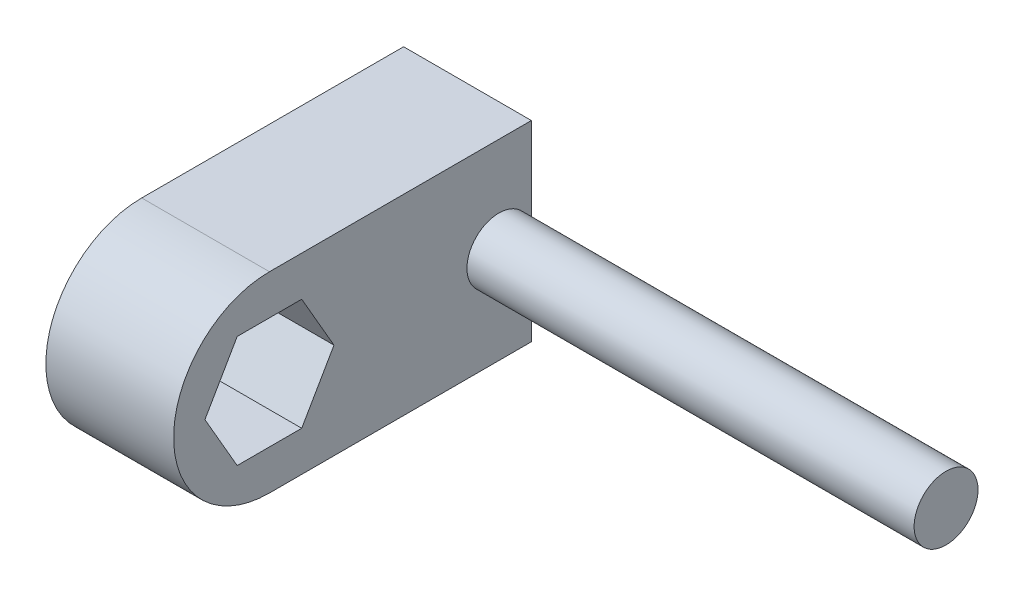
ISO-10303-21;
HEADER;
FILE_DESCRIPTION(('STEP AP214'),'2;1');
FILE_NAME('part.step','',(''),(''),'','','');
FILE_SCHEMA(('AUTOMOTIVE_DESIGN { 1 0 10303 214 1 1 1 1 }'));
ENDSEC;
DATA;
#1=APPLICATION_CONTEXT('core data for automotive mechanical design processes');
#2=APPLICATION_PROTOCOL_DEFINITION('international standard','automotive_design',2000,#1);
#3=PRODUCT_CONTEXT('',#1,'mechanical');
#4=PRODUCT('Part','Part','',(#3));
#5=PRODUCT_RELATED_PRODUCT_CATEGORY('part','',(#4));
#6=PRODUCT_DEFINITION_FORMATION('','',#4);
#7=PRODUCT_DEFINITION_CONTEXT('part definition',#1,'design');
#8=PRODUCT_DEFINITION('design','',#6,#7);
#9=PRODUCT_DEFINITION_SHAPE('','',#8);
#10=(LENGTH_UNIT() NAMED_UNIT(*) SI_UNIT(.MILLI.,.METRE.));
#11=(NAMED_UNIT(*) PLANE_ANGLE_UNIT() SI_UNIT($,.RADIAN.));
#12=(NAMED_UNIT(*) SI_UNIT($,.STERADIAN.) SOLID_ANGLE_UNIT());
#13=UNCERTAINTY_MEASURE_WITH_UNIT(LENGTH_MEASURE(1.E-05),#10,'distance_accuracy_value','');
#14=(GEOMETRIC_REPRESENTATION_CONTEXT(3) GLOBAL_UNCERTAINTY_ASSIGNED_CONTEXT((#13)) GLOBAL_UNIT_ASSIGNED_CONTEXT((#10,
#11,#12)) REPRESENTATION_CONTEXT('',''));
#15=CARTESIAN_POINT('',(0.,0.,0.));
#16=DIRECTION('',(0.,0.,1.));
#17=DIRECTION('',(1.,0.,0.));
#18=AXIS2_PLACEMENT_3D('',#15,#16,#17);
#19=CARTESIAN_POINT('',(10.,0.,0.));
#20=DIRECTION('',(1.,0.,0.));
#21=DIRECTION('',(0.,0.,-1.));
#22=AXIS2_PLACEMENT_3D('',#19,#20,#21);
#23=PLANE('',#22);
#24=CARTESIAN_POINT('',(10.,0.,-17.9560429147569));
#25=DIRECTION('',(1.,0.,0.));
#26=DIRECTION('',(0.,0.,-1.));
#27=AXIS2_PLACEMENT_3D('',#24,#25,#26);
#28=CIRCLE('',#27,2.5);
#29=CARTESIAN_POINT('',(10.,0.,-20.4560429147569));
#30=VERTEX_POINT('',#29);
#31=EDGE_CURVE('E282',#30,#30,#28,.T.);
#32=ORIENTED_EDGE('',*,*,#31,.F.);
#33=EDGE_LOOP('',(#32));
#34=FACE_BOUND('',#33,.T.);
#35=DIRECTION('',(0.,0.,-1.));
#36=VECTOR('',#35,1.);
#37=CARTESIAN_POINT('',(10.,7.5,0.));
#38=LINE('',#37,#36);
#39=CARTESIAN_POINT('',(10.,7.5,0.));
#40=VERTEX_POINT('',#39);
#41=CARTESIAN_POINT('',(10.,7.5,-20.5));
#42=VERTEX_POINT('',#41);
#43=EDGE_CURVE('E193',#40,#42,#38,.T.);
#44=ORIENTED_EDGE('',*,*,#43,.F.);
#45=CARTESIAN_POINT('',(10.,0.,0.));
#46=DIRECTION('',(1.,0.,0.));
#47=DIRECTION('',(0.,0.,-1.));
#48=AXIS2_PLACEMENT_3D('',#45,#46,#47);
#49=CIRCLE('',#48,7.5);
#50=CARTESIAN_POINT('',(10.,-7.5,0.));
#51=VERTEX_POINT('',#50);
#52=EDGE_CURVE('E203',#40,#51,#49,.T.);
#53=ORIENTED_EDGE('',*,*,#52,.T.);
#54=DIRECTION('',(0.,0.,1.));
#55=VECTOR('',#54,1.);
#56=CARTESIAN_POINT('',(10.,-7.5,-20.5));
#57=LINE('',#56,#55);
#58=CARTESIAN_POINT('',(10.,-7.5,-20.5));
#59=VERTEX_POINT('',#58);
#60=EDGE_CURVE('E200',#59,#51,#57,.T.);
#61=ORIENTED_EDGE('',*,*,#60,.F.);
#62=DIRECTION('',(0.,-1.,0.));
#63=VECTOR('',#62,1.);
#64=CARTESIAN_POINT('',(10.,7.5,-20.5));
#65=LINE('',#64,#63);
#66=EDGE_CURVE('E196',#42,#59,#65,.T.);
#67=ORIENTED_EDGE('',*,*,#66,.F.);
#68=EDGE_LOOP('',(#44,#53,#61,#67));
#69=FACE_BOUND('',#68,.T.);
#70=DIRECTION('',(0.,0.866025403784438,0.5));
#71=VECTOR('',#70,1.);
#72=CARTESIAN_POINT('',(10.,0.,-5.05));
#73=LINE('',#72,#71);
#74=CARTESIAN_POINT('',(10.,0.,-5.05));
#75=VERTEX_POINT('',#74);
#76=CARTESIAN_POINT('',(10.,4.37342828911142,-2.525));
#77=VERTEX_POINT('',#76);
#78=EDGE_CURVE('E148',#75,#77,#73,.T.);
#79=ORIENTED_EDGE('',*,*,#78,.F.);
#80=DIRECTION('',(0.,0.866025403784439,-0.5));
#81=VECTOR('',#80,1.);
#82=CARTESIAN_POINT('',(10.,-4.37342828911142,-2.525));
#83=LINE('',#82,#81);
#84=CARTESIAN_POINT('',(10.,-4.37342828911142,-2.525));
#85=VERTEX_POINT('',#84);
#86=EDGE_CURVE('E140',#85,#75,#83,.T.);
#87=ORIENTED_EDGE('',*,*,#86,.F.);
#88=DIRECTION('',(0.,0.,-1.));
#89=VECTOR('',#88,1.);
#90=CARTESIAN_POINT('',(10.,-4.37342828911142,2.525));
#91=LINE('',#90,#89);
#92=CARTESIAN_POINT('',(10.,-4.37342828911142,2.525));
#93=VERTEX_POINT('',#92);
#94=EDGE_CURVE('E170',#93,#85,#91,.T.);
#95=ORIENTED_EDGE('',*,*,#94,.F.);
#96=DIRECTION('',(0.,-0.866025403784439,-0.5));
#97=VECTOR('',#96,1.);
#98=CARTESIAN_POINT('',(10.,0.,5.05));
#99=LINE('',#98,#97);
#100=CARTESIAN_POINT('',(10.,0.,5.05));
#101=VERTEX_POINT('',#100);
#102=EDGE_CURVE('E168',#101,#93,#99,.T.);
#103=ORIENTED_EDGE('',*,*,#102,.F.);
#104=DIRECTION('',(0.,-0.866025403784439,0.5));
#105=VECTOR('',#104,1.);
#106=CARTESIAN_POINT('',(10.,4.37342828911142,2.525));
#107=LINE('',#106,#105);
#108=CARTESIAN_POINT('',(10.,4.37342828911142,2.525));
#109=VERTEX_POINT('',#108);
#110=EDGE_CURVE('E163',#109,#101,#107,.T.);
#111=ORIENTED_EDGE('',*,*,#110,.F.);
#112=DIRECTION('',(0.,0.,1.));
#113=VECTOR('',#112,1.);
#114=CARTESIAN_POINT('',(10.,4.37342828911142,-2.525));
#115=LINE('',#114,#113);
#116=EDGE_CURVE('E161',#77,#109,#115,.T.);
#117=ORIENTED_EDGE('',*,*,#116,.F.);
#118=EDGE_LOOP('',(#79,#87,#95,#103,#111,#117));
#119=FACE_BOUND('',#118,.T.);
#120=ADVANCED_FACE('F62',(#34,#69,#119),#23,.T.);
#121=CARTESIAN_POINT('',(0.,0.,0.));
#122=DIRECTION('',(1.,0.,0.));
#123=DIRECTION('',(0.,0.,-1.));
#124=AXIS2_PLACEMENT_3D('',#121,#122,#123);
#125=PLANE('',#124);
#126=DIRECTION('',(0.,0.,-1.));
#127=VECTOR('',#126,1.);
#128=CARTESIAN_POINT('',(0.,7.5,0.));
#129=LINE('',#128,#127);
#130=CARTESIAN_POINT('',(0.,7.5,0.));
#131=VERTEX_POINT('',#130);
#132=CARTESIAN_POINT('',(0.,7.5,-20.5));
#133=VERTEX_POINT('',#132);
#134=EDGE_CURVE('E156',#131,#133,#129,.T.);
#135=ORIENTED_EDGE('',*,*,#134,.T.);
#136=DIRECTION('',(0.,-1.,0.));
#137=VECTOR('',#136,1.);
#138=CARTESIAN_POINT('',(0.,7.5,-20.5));
#139=LINE('',#138,#137);
#140=CARTESIAN_POINT('',(0.,-7.5,-20.5));
#141=VERTEX_POINT('',#140);
#142=EDGE_CURVE('E207',#133,#141,#139,.T.);
#143=ORIENTED_EDGE('',*,*,#142,.T.);
#144=DIRECTION('',(0.,0.,1.));
#145=VECTOR('',#144,1.);
#146=CARTESIAN_POINT('',(0.,-7.5,-20.5));
#147=LINE('',#146,#145);
#148=CARTESIAN_POINT('',(0.,-7.5,0.));
#149=VERTEX_POINT('',#148);
#150=EDGE_CURVE('E210',#141,#149,#147,.T.);
#151=ORIENTED_EDGE('',*,*,#150,.T.);
#152=CARTESIAN_POINT('',(0.,0.,0.));
#153=DIRECTION('',(1.,0.,0.));
#154=DIRECTION('',(0.,0.,-1.));
#155=AXIS2_PLACEMENT_3D('',#152,#153,#154);
#156=CIRCLE('',#155,7.5);
#157=EDGE_CURVE('E197',#131,#149,#156,.T.);
#158=ORIENTED_EDGE('',*,*,#157,.F.);
#159=EDGE_LOOP('',(#135,#143,#151,#158));
#160=FACE_BOUND('',#159,.T.);
#161=DIRECTION('',(0.,0.866025403784439,-0.5));
#162=VECTOR('',#161,1.);
#163=CARTESIAN_POINT('',(0.,-4.37342828911142,-2.525));
#164=LINE('',#163,#162);
#165=CARTESIAN_POINT('',(0.,-4.37342828911142,-2.525));
#166=VERTEX_POINT('',#165);
#167=CARTESIAN_POINT('',(0.,0.,-5.05));
#168=VERTEX_POINT('',#167);
#169=EDGE_CURVE('E87',#166,#168,#164,.T.);
#170=ORIENTED_EDGE('',*,*,#169,.T.);
#171=DIRECTION('',(0.,0.866025403784438,0.5));
#172=VECTOR('',#171,1.);
#173=CARTESIAN_POINT('',(0.,0.,-5.05));
#174=LINE('',#173,#172);
#175=CARTESIAN_POINT('',(0.,4.37342828911142,-2.525));
#176=VERTEX_POINT('',#175);
#177=EDGE_CURVE('E155',#168,#176,#174,.T.);
#178=ORIENTED_EDGE('',*,*,#177,.T.);
#179=DIRECTION('',(0.,0.,1.));
#180=VECTOR('',#179,1.);
#181=CARTESIAN_POINT('',(0.,4.37342828911142,-2.525));
#182=LINE('',#181,#180);
#183=CARTESIAN_POINT('',(0.,4.37342828911142,2.525));
#184=VERTEX_POINT('',#183);
#185=EDGE_CURVE('E175',#176,#184,#182,.T.);
#186=ORIENTED_EDGE('',*,*,#185,.T.);
#187=DIRECTION('',(0.,-0.866025403784439,0.5));
#188=VECTOR('',#187,1.);
#189=CARTESIAN_POINT('',(0.,4.37342828911142,2.525));
#190=LINE('',#189,#188);
#191=CARTESIAN_POINT('',(0.,0.,5.05));
#192=VERTEX_POINT('',#191);
#193=EDGE_CURVE('E178',#184,#192,#190,.T.);
#194=ORIENTED_EDGE('',*,*,#193,.T.);
#195=DIRECTION('',(0.,-0.866025403784439,-0.5));
#196=VECTOR('',#195,1.);
#197=CARTESIAN_POINT('',(0.,0.,5.05));
#198=LINE('',#197,#196);
#199=CARTESIAN_POINT('',(0.,-4.37342828911142,2.525));
#200=VERTEX_POINT('',#199);
#201=EDGE_CURVE('E181',#192,#200,#198,.T.);
#202=ORIENTED_EDGE('',*,*,#201,.T.);
#203=DIRECTION('',(0.,0.,-1.));
#204=VECTOR('',#203,1.);
#205=CARTESIAN_POINT('',(0.,-4.37342828911142,2.525));
#206=LINE('',#205,#204);
#207=EDGE_CURVE('E149',#200,#166,#206,.T.);
#208=ORIENTED_EDGE('',*,*,#207,.T.);
#209=EDGE_LOOP('',(#170,#178,#186,#194,#202,#208));
#210=FACE_BOUND('',#209,.T.);
#211=ADVANCED_FACE('F226',(#160,#210),#125,.F.);
#212=CARTESIAN_POINT('',(10.,7.5,0.));
#213=DIRECTION('',(0.,1.,0.));
#214=DIRECTION('',(0.,0.,1.));
#215=AXIS2_PLACEMENT_3D('',#212,#213,#214);
#216=PLANE('',#215);
#217=ORIENTED_EDGE('',*,*,#134,.F.);
#218=DIRECTION('',(-1.,0.,0.));
#219=VECTOR('',#218,1.);
#220=CARTESIAN_POINT('',(10.,7.5,0.));
#221=LINE('',#220,#219);
#222=EDGE_CURVE('E12',#40,#131,#221,.T.);
#223=ORIENTED_EDGE('',*,*,#222,.F.);
#224=ORIENTED_EDGE('',*,*,#43,.T.);
#225=DIRECTION('',(-1.,0.,0.));
#226=VECTOR('',#225,1.);
#227=CARTESIAN_POINT('',(10.,7.5,-20.5));
#228=LINE('',#227,#226);
#229=EDGE_CURVE('E66',#42,#133,#228,.T.);
#230=ORIENTED_EDGE('',*,*,#229,.T.);
#231=EDGE_LOOP('',(#217,#223,#224,#230));
#232=FACE_BOUND('',#231,.T.);
#233=ADVANCED_FACE('F64',(#232),#216,.T.);
#234=CARTESIAN_POINT('',(10.,0.,0.));
#235=DIRECTION('',(-1.,0.,0.));
#236=DIRECTION('',(0.,0.,1.));
#237=AXIS2_PLACEMENT_3D('',#234,#235,#236);
#238=CYLINDRICAL_SURFACE('',#237,7.5);
#239=ORIENTED_EDGE('',*,*,#157,.T.);
#240=DIRECTION('',(-1.,0.,0.));
#241=VECTOR('',#240,1.);
#242=CARTESIAN_POINT('',(10.,-7.5,0.));
#243=LINE('',#242,#241);
#244=EDGE_CURVE('E71',#51,#149,#243,.T.);
#245=ORIENTED_EDGE('',*,*,#244,.F.);
#246=ORIENTED_EDGE('',*,*,#52,.F.);
#247=ORIENTED_EDGE('',*,*,#222,.T.);
#248=EDGE_LOOP('',(#239,#245,#246,#247));
#249=FACE_BOUND('',#248,.T.);
#250=ADVANCED_FACE('F230',(#249),#238,.T.);
#251=CARTESIAN_POINT('',(10.,-7.5,-20.5));
#252=DIRECTION('',(0.,-1.,0.));
#253=DIRECTION('',(0.,0.,-1.));
#254=AXIS2_PLACEMENT_3D('',#251,#252,#253);
#255=PLANE('',#254);
#256=ORIENTED_EDGE('',*,*,#150,.F.);
#257=DIRECTION('',(-1.,0.,0.));
#258=VECTOR('',#257,1.);
#259=CARTESIAN_POINT('',(10.,-7.5,-20.5));
#260=LINE('',#259,#258);
#261=EDGE_CURVE('E215',#59,#141,#260,.T.);
#262=ORIENTED_EDGE('',*,*,#261,.F.);
#263=ORIENTED_EDGE('',*,*,#60,.T.);
#264=ORIENTED_EDGE('',*,*,#244,.T.);
#265=EDGE_LOOP('',(#256,#262,#263,#264));
#266=FACE_BOUND('',#265,.T.);
#267=ADVANCED_FACE('F235',(#266),#255,.T.);
#268=CARTESIAN_POINT('',(10.,7.5,-20.5));
#269=DIRECTION('',(0.,0.,-1.));
#270=DIRECTION('',(-1.,0.,0.));
#271=AXIS2_PLACEMENT_3D('',#268,#269,#270);
#272=PLANE('',#271);
#273=ORIENTED_EDGE('',*,*,#142,.F.);
#274=ORIENTED_EDGE('',*,*,#229,.F.);
#275=ORIENTED_EDGE('',*,*,#66,.T.);
#276=ORIENTED_EDGE('',*,*,#261,.T.);
#277=EDGE_LOOP('',(#273,#274,#275,#276));
#278=FACE_BOUND('',#277,.T.);
#279=ADVANCED_FACE('F223',(#278),#272,.T.);
#280=CARTESIAN_POINT('',(10.,-4.37342828911142,-2.525));
#281=DIRECTION('',(0.,0.5,0.866025403784439));
#282=DIRECTION('',(0.,-0.866025403784439,0.5));
#283=AXIS2_PLACEMENT_3D('',#280,#281,#282);
#284=PLANE('',#283);
#285=ORIENTED_EDGE('',*,*,#169,.F.);
#286=DIRECTION('',(-1.,0.,0.));
#287=VECTOR('',#286,1.);
#288=CARTESIAN_POINT('',(10.,-4.37342828911142,-2.525));
#289=LINE('',#288,#287);
#290=EDGE_CURVE('E144',#85,#166,#289,.T.);
#291=ORIENTED_EDGE('',*,*,#290,.F.);
#292=ORIENTED_EDGE('',*,*,#86,.T.);
#293=DIRECTION('',(-1.,0.,0.));
#294=VECTOR('',#293,1.);
#295=CARTESIAN_POINT('',(10.,0.,-5.05));
#296=LINE('',#295,#294);
#297=EDGE_CURVE('E143',#75,#168,#296,.T.);
#298=ORIENTED_EDGE('',*,*,#297,.T.);
#299=EDGE_LOOP('',(#285,#291,#292,#298));
#300=FACE_BOUND('',#299,.T.);
#301=ADVANCED_FACE('F142',(#300),#284,.T.);
#302=CARTESIAN_POINT('',(10.,0.,-5.05));
#303=DIRECTION('',(0.,-0.5,0.866025403784439));
#304=DIRECTION('',(0.,-0.866025403784439,-0.5));
#305=AXIS2_PLACEMENT_3D('',#302,#303,#304);
#306=PLANE('',#305);
#307=ORIENTED_EDGE('',*,*,#177,.F.);
#308=ORIENTED_EDGE('',*,*,#297,.F.);
#309=ORIENTED_EDGE('',*,*,#78,.T.);
#310=DIRECTION('',(-1.,0.,0.));
#311=VECTOR('',#310,1.);
#312=CARTESIAN_POINT('',(10.,4.37342828911142,-2.525));
#313=LINE('',#312,#311);
#314=EDGE_CURVE('E157',#77,#176,#313,.T.);
#315=ORIENTED_EDGE('',*,*,#314,.T.);
#316=EDGE_LOOP('',(#307,#308,#309,#315));
#317=FACE_BOUND('',#316,.T.);
#318=ADVANCED_FACE('F152',(#317),#306,.T.);
#319=CARTESIAN_POINT('',(10.,4.37342828911142,-2.525));
#320=DIRECTION('',(0.,-1.,0.));
#321=DIRECTION('',(0.,0.,-1.));
#322=AXIS2_PLACEMENT_3D('',#319,#320,#321);
#323=PLANE('',#322);
#324=ORIENTED_EDGE('',*,*,#185,.F.);
#325=ORIENTED_EDGE('',*,*,#314,.F.);
#326=ORIENTED_EDGE('',*,*,#116,.T.);
#327=DIRECTION('',(-1.,0.,0.));
#328=VECTOR('',#327,1.);
#329=CARTESIAN_POINT('',(10.,4.37342828911142,2.525));
#330=LINE('',#329,#328);
#331=EDGE_CURVE('E190',#109,#184,#330,.T.);
#332=ORIENTED_EDGE('',*,*,#331,.T.);
#333=EDGE_LOOP('',(#324,#325,#326,#332));
#334=FACE_BOUND('',#333,.T.);
#335=ADVANCED_FACE('F256',(#334),#323,.T.);
#336=CARTESIAN_POINT('',(10.,4.37342828911142,2.525));
#337=DIRECTION('',(0.,-0.5,-0.866025403784439));
#338=DIRECTION('',(0.,0.866025403784439,-0.5));
#339=AXIS2_PLACEMENT_3D('',#336,#337,#338);
#340=PLANE('',#339);
#341=ORIENTED_EDGE('',*,*,#193,.F.);
#342=ORIENTED_EDGE('',*,*,#331,.F.);
#343=ORIENTED_EDGE('',*,*,#110,.T.);
#344=DIRECTION('',(-1.,0.,0.));
#345=VECTOR('',#344,1.);
#346=CARTESIAN_POINT('',(10.,0.,5.05));
#347=LINE('',#346,#345);
#348=EDGE_CURVE('E188',#101,#192,#347,.T.);
#349=ORIENTED_EDGE('',*,*,#348,.T.);
#350=EDGE_LOOP('',(#341,#342,#343,#349));
#351=FACE_BOUND('',#350,.T.);
#352=ADVANCED_FACE('F259',(#351),#340,.T.);
#353=CARTESIAN_POINT('',(10.,0.,5.05));
#354=DIRECTION('',(0.,0.5,-0.866025403784439));
#355=DIRECTION('',(0.,0.866025403784439,0.5));
#356=AXIS2_PLACEMENT_3D('',#353,#354,#355);
#357=PLANE('',#356);
#358=ORIENTED_EDGE('',*,*,#201,.F.);
#359=ORIENTED_EDGE('',*,*,#348,.F.);
#360=ORIENTED_EDGE('',*,*,#102,.T.);
#361=DIRECTION('',(-1.,0.,0.));
#362=VECTOR('',#361,1.);
#363=CARTESIAN_POINT('',(10.,-4.37342828911142,2.525));
#364=LINE('',#363,#362);
#365=EDGE_CURVE('E79',#93,#200,#364,.T.);
#366=ORIENTED_EDGE('',*,*,#365,.T.);
#367=EDGE_LOOP('',(#358,#359,#360,#366));
#368=FACE_BOUND('',#367,.T.);
#369=ADVANCED_FACE('F263',(#368),#357,.T.);
#370=CARTESIAN_POINT('',(10.,-4.37342828911142,2.525));
#371=DIRECTION('',(0.,1.,0.));
#372=DIRECTION('',(0.,0.,1.));
#373=AXIS2_PLACEMENT_3D('',#370,#371,#372);
#374=PLANE('',#373);
#375=ORIENTED_EDGE('',*,*,#207,.F.);
#376=ORIENTED_EDGE('',*,*,#365,.F.);
#377=ORIENTED_EDGE('',*,*,#94,.T.);
#378=ORIENTED_EDGE('',*,*,#290,.T.);
#379=EDGE_LOOP('',(#375,#376,#377,#378));
#380=FACE_BOUND('',#379,.T.);
#381=ADVANCED_FACE('F267',(#380),#374,.T.);
#382=CARTESIAN_POINT('',(45.,0.,-17.9560429147569));
#383=DIRECTION('',(-1.,0.,0.));
#384=DIRECTION('',(0.,0.,1.));
#385=AXIS2_PLACEMENT_3D('',#382,#383,#384);
#386=CYLINDRICAL_SURFACE('',#385,2.5);
#387=CARTESIAN_POINT('',(45.,0.,-17.9560429147569));
#388=DIRECTION('',(1.,0.,0.));
#389=DIRECTION('',(0.,0.,-1.));
#390=AXIS2_PLACEMENT_3D('',#387,#388,#389);
#391=CIRCLE('',#390,2.5);
#392=CARTESIAN_POINT('',(45.,0.,-20.4560429147569));
#393=VERTEX_POINT('',#392);
#394=EDGE_CURVE('E173',#393,#393,#391,.T.);
#395=ORIENTED_EDGE('',*,*,#394,.F.);
#396=EDGE_LOOP('',(#395));
#397=FACE_BOUND('',#396,.T.);
#398=ORIENTED_EDGE('',*,*,#31,.T.);
#399=EDGE_LOOP('',(#398));
#400=FACE_BOUND('',#399,.T.);
#401=ADVANCED_FACE('F271',(#397,#400),#386,.T.);
#402=CARTESIAN_POINT('',(45.,0.,-17.9560429147569));
#403=DIRECTION('',(1.,0.,0.));
#404=DIRECTION('',(0.,0.,-1.));
#405=AXIS2_PLACEMENT_3D('',#402,#403,#404);
#406=PLANE('',#405);
#407=ORIENTED_EDGE('',*,*,#394,.T.);
#408=EDGE_LOOP('',(#407));
#409=FACE_BOUND('',#408,.T.);
#410=ADVANCED_FACE('F274',(#409),#406,.T.);
#411=CLOSED_SHELL('',(#120,#211,#233,#250,#267,#279,#301,#318,#335,#352,#369,#381,#401,#410));
#412=MANIFOLD_SOLID_BREP('B2',#411);
#413=ADVANCED_BREP_SHAPE_REPRESENTATION('',(#18,#412),#14);
#414=SHAPE_DEFINITION_REPRESENTATION(#9,#413);
ENDSEC;
END-ISO-10303-21;
